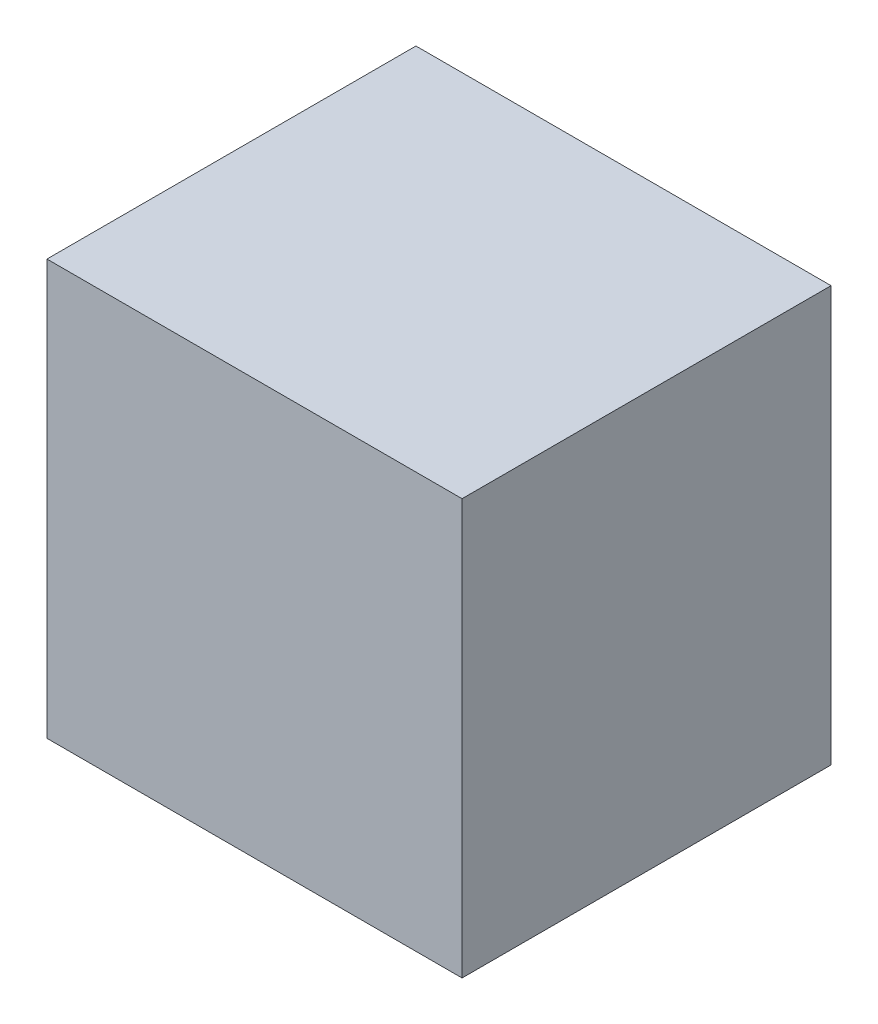
ISO-10303-21;
HEADER;
FILE_DESCRIPTION(('STEP AP214'),'2;1');
FILE_NAME('part.step','',(''),(''),'','','');
FILE_SCHEMA(('AUTOMOTIVE_DESIGN { 1 0 10303 214 1 1 1 1 }'));
ENDSEC;
DATA;
#1=APPLICATION_CONTEXT('core data for automotive mechanical design processes');
#2=APPLICATION_PROTOCOL_DEFINITION('international standard','automotive_design',2000,#1);
#3=PRODUCT_CONTEXT('',#1,'mechanical');
#4=PRODUCT('Part','Part','',(#3));
#5=PRODUCT_RELATED_PRODUCT_CATEGORY('part','',(#4));
#6=PRODUCT_DEFINITION_FORMATION('','',#4);
#7=PRODUCT_DEFINITION_CONTEXT('part definition',#1,'design');
#8=PRODUCT_DEFINITION('design','',#6,#7);
#9=PRODUCT_DEFINITION_SHAPE('','',#8);
#10=(LENGTH_UNIT() NAMED_UNIT(*) SI_UNIT(.MILLI.,.METRE.));
#11=(NAMED_UNIT(*) PLANE_ANGLE_UNIT() SI_UNIT($,.RADIAN.));
#12=(NAMED_UNIT(*) SI_UNIT($,.STERADIAN.) SOLID_ANGLE_UNIT());
#13=UNCERTAINTY_MEASURE_WITH_UNIT(LENGTH_MEASURE(1.E-05),#10,'distance_accuracy_value','');
#14=(GEOMETRIC_REPRESENTATION_CONTEXT(3) GLOBAL_UNCERTAINTY_ASSIGNED_CONTEXT((#13)) GLOBAL_UNIT_ASSIGNED_CONTEXT((#10,
#11,#12)) REPRESENTATION_CONTEXT('',''));
#15=CARTESIAN_POINT('',(0.,0.,0.));
#16=DIRECTION('',(0.,0.,1.));
#17=DIRECTION('',(1.,0.,0.));
#18=AXIS2_PLACEMENT_3D('',#15,#16,#17);
#19=CARTESIAN_POINT('',(685.8,685.8,1219.2));
#20=DIRECTION('',(-1.,0.,0.));
#21=DIRECTION('',(0.,-1.,0.));
#22=AXIS2_PLACEMENT_3D('',#19,#20,#21);
#23=PLANE('',#22);
#24=DIRECTION('',(0.,1.,0.));
#25=VECTOR('',#24,1.);
#26=CARTESIAN_POINT('',(685.8,685.8,0.));
#27=LINE('',#26,#25);
#28=CARTESIAN_POINT('',(685.8,-685.8,0.));
#29=VERTEX_POINT('',#28);
#30=CARTESIAN_POINT('',(685.8,685.8,0.));
#31=VERTEX_POINT('',#30);
#32=EDGE_CURVE('E100',#29,#31,#27,.T.);
#33=ORIENTED_EDGE('',*,*,#32,.T.);
#34=DIRECTION('',(0.,0.,-1.));
#35=VECTOR('',#34,1.);
#36=CARTESIAN_POINT('',(685.8,685.8,1219.2));
#37=LINE('',#36,#35);
#38=CARTESIAN_POINT('',(685.8,685.8,1219.2));
#39=VERTEX_POINT('',#38);
#40=EDGE_CURVE('E11',#39,#31,#37,.T.);
#41=ORIENTED_EDGE('',*,*,#40,.F.);
#42=DIRECTION('',(0.,1.,0.));
#43=VECTOR('',#42,1.);
#44=CARTESIAN_POINT('',(685.8,685.8,1219.2));
#45=LINE('',#44,#43);
#46=CARTESIAN_POINT('',(685.8,-685.8,1219.2));
#47=VERTEX_POINT('',#46);
#48=EDGE_CURVE('E88',#47,#39,#45,.T.);
#49=ORIENTED_EDGE('',*,*,#48,.F.);
#50=DIRECTION('',(0.,0.,-1.));
#51=VECTOR('',#50,1.);
#52=CARTESIAN_POINT('',(685.8,-685.8,1219.2));
#53=LINE('',#52,#51);
#54=EDGE_CURVE('E96',#47,#29,#53,.T.);
#55=ORIENTED_EDGE('',*,*,#54,.T.);
#56=EDGE_LOOP('',(#33,#41,#49,#55));
#57=FACE_BOUND('',#56,.T.);
#58=ADVANCED_FACE('F37',(#57),#23,.F.);
#59=CARTESIAN_POINT('',(-685.8,685.8,1219.2));
#60=DIRECTION('',(0.,-1.,0.));
#61=DIRECTION('',(0.,0.,-1.));
#62=AXIS2_PLACEMENT_3D('',#59,#60,#61);
#63=PLANE('',#62);
#64=DIRECTION('',(-1.,0.,0.));
#65=VECTOR('',#64,1.);
#66=CARTESIAN_POINT('',(-685.8,685.8,0.));
#67=LINE('',#66,#65);
#68=CARTESIAN_POINT('',(-685.8,685.8,0.));
#69=VERTEX_POINT('',#68);
#70=EDGE_CURVE('E92',#31,#69,#67,.T.);
#71=ORIENTED_EDGE('',*,*,#70,.T.);
#72=DIRECTION('',(0.,0.,-1.));
#73=VECTOR('',#72,1.);
#74=CARTESIAN_POINT('',(-685.8,685.8,1219.2));
#75=LINE('',#74,#73);
#76=CARTESIAN_POINT('',(-685.8,685.8,1219.2));
#77=VERTEX_POINT('',#76);
#78=EDGE_CURVE('E45',#77,#69,#75,.T.);
#79=ORIENTED_EDGE('',*,*,#78,.F.);
#80=DIRECTION('',(-1.,0.,0.));
#81=VECTOR('',#80,1.);
#82=CARTESIAN_POINT('',(-685.8,685.8,1219.2));
#83=LINE('',#82,#81);
#84=EDGE_CURVE('E83',#39,#77,#83,.T.);
#85=ORIENTED_EDGE('',*,*,#84,.F.);
#86=ORIENTED_EDGE('',*,*,#40,.T.);
#87=EDGE_LOOP('',(#71,#79,#85,#86));
#88=FACE_BOUND('',#87,.T.);
#89=ADVANCED_FACE('F91',(#88),#63,.F.);
#90=CARTESIAN_POINT('',(-685.8,685.8,1219.2));
#91=DIRECTION('',(1.,0.,0.));
#92=DIRECTION('',(0.,1.,0.));
#93=AXIS2_PLACEMENT_3D('',#90,#91,#92);
#94=PLANE('',#93);
#95=DIRECTION('',(0.,-1.,0.));
#96=VECTOR('',#95,1.);
#97=CARTESIAN_POINT('',(-685.8,685.8,0.));
#98=LINE('',#97,#96);
#99=CARTESIAN_POINT('',(-685.8,-685.8,0.));
#100=VERTEX_POINT('',#99);
#101=EDGE_CURVE('E70',#69,#100,#98,.T.);
#102=ORIENTED_EDGE('',*,*,#101,.T.);
#103=DIRECTION('',(0.,0.,-1.));
#104=VECTOR('',#103,1.);
#105=CARTESIAN_POINT('',(-685.8,-685.8,1219.2));
#106=LINE('',#105,#104);
#107=CARTESIAN_POINT('',(-685.8,-685.8,1219.2));
#108=VERTEX_POINT('',#107);
#109=EDGE_CURVE('E93',#108,#100,#106,.T.);
#110=ORIENTED_EDGE('',*,*,#109,.F.);
#111=DIRECTION('',(0.,-1.,0.));
#112=VECTOR('',#111,1.);
#113=CARTESIAN_POINT('',(-685.8,685.8,1219.2));
#114=LINE('',#113,#112);
#115=EDGE_CURVE('E86',#77,#108,#114,.T.);
#116=ORIENTED_EDGE('',*,*,#115,.F.);
#117=ORIENTED_EDGE('',*,*,#78,.T.);
#118=EDGE_LOOP('',(#102,#110,#116,#117));
#119=FACE_BOUND('',#118,.T.);
#120=ADVANCED_FACE('F94',(#119),#94,.F.);
#121=CARTESIAN_POINT('',(-685.8,-685.8,1219.2));
#122=DIRECTION('',(0.,1.,0.));
#123=DIRECTION('',(0.,0.,1.));
#124=AXIS2_PLACEMENT_3D('',#121,#122,#123);
#125=PLANE('',#124);
#126=DIRECTION('',(1.,0.,0.));
#127=VECTOR('',#126,1.);
#128=CARTESIAN_POINT('',(-685.8,-685.8,0.));
#129=LINE('',#128,#127);
#130=EDGE_CURVE('E76',#100,#29,#129,.T.);
#131=ORIENTED_EDGE('',*,*,#130,.T.);
#132=ORIENTED_EDGE('',*,*,#54,.F.);
#133=DIRECTION('',(1.,0.,0.));
#134=VECTOR('',#133,1.);
#135=CARTESIAN_POINT('',(-685.8,-685.8,1219.2));
#136=LINE('',#135,#134);
#137=EDGE_CURVE('E53',#108,#47,#136,.T.);
#138=ORIENTED_EDGE('',*,*,#137,.F.);
#139=ORIENTED_EDGE('',*,*,#109,.T.);
#140=EDGE_LOOP('',(#131,#132,#138,#139));
#141=FACE_BOUND('',#140,.T.);
#142=ADVANCED_FACE('F107',(#141),#125,.F.);
#143=CARTESIAN_POINT('',(0.,0.,1219.2));
#144=DIRECTION('',(0.,0.,1.));
#145=DIRECTION('',(1.,0.,0.));
#146=AXIS2_PLACEMENT_3D('',#143,#144,#145);
#147=PLANE('',#146);
#148=ORIENTED_EDGE('',*,*,#48,.T.);
#149=ORIENTED_EDGE('',*,*,#84,.T.);
#150=ORIENTED_EDGE('',*,*,#115,.T.);
#151=ORIENTED_EDGE('',*,*,#137,.T.);
#152=EDGE_LOOP('',(#148,#149,#150,#151));
#153=FACE_BOUND('',#152,.T.);
#154=ADVANCED_FACE('F84',(#153),#147,.T.);
#155=CARTESIAN_POINT('',(0.,0.,0.));
#156=DIRECTION('',(0.,0.,1.));
#157=DIRECTION('',(1.,0.,0.));
#158=AXIS2_PLACEMENT_3D('',#155,#156,#157);
#159=PLANE('',#158);
#160=ORIENTED_EDGE('',*,*,#32,.F.);
#161=ORIENTED_EDGE('',*,*,#130,.F.);
#162=ORIENTED_EDGE('',*,*,#101,.F.);
#163=ORIENTED_EDGE('',*,*,#70,.F.);
#164=EDGE_LOOP('',(#160,#161,#162,#163));
#165=FACE_BOUND('',#164,.T.);
#166=ADVANCED_FACE('F110',(#165),#159,.F.);
#167=CLOSED_SHELL('',(#58,#89,#120,#142,#154,#166));
#168=MANIFOLD_SOLID_BREP('B2',#167);
#169=ADVANCED_BREP_SHAPE_REPRESENTATION('',(#18,#168),#14);
#170=SHAPE_DEFINITION_REPRESENTATION(#9,#169);
ENDSEC;
END-ISO-10303-21;
